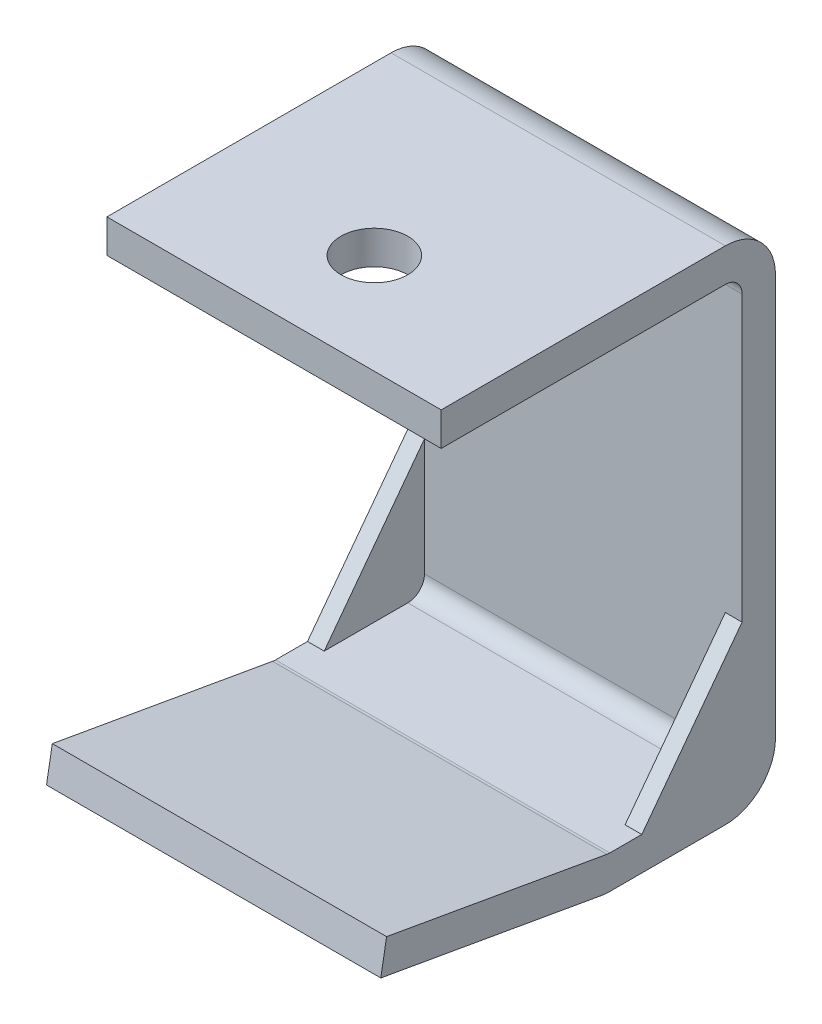
ISO-10303-21;
HEADER;
FILE_DESCRIPTION(('STEP AP214'),'2;1');
FILE_NAME('part.step','',(''),(''),'','','');
FILE_SCHEMA(('AUTOMOTIVE_DESIGN { 1 0 10303 214 1 1 1 1 }'));
ENDSEC;
DATA;
#1=APPLICATION_CONTEXT('core data for automotive mechanical design processes');
#2=APPLICATION_PROTOCOL_DEFINITION('international standard','automotive_design',2000,#1);
#3=PRODUCT_CONTEXT('',#1,'mechanical');
#4=PRODUCT('Part','Part','',(#3));
#5=PRODUCT_RELATED_PRODUCT_CATEGORY('part','',(#4));
#6=PRODUCT_DEFINITION_FORMATION('','',#4);
#7=PRODUCT_DEFINITION_CONTEXT('part definition',#1,'design');
#8=PRODUCT_DEFINITION('design','',#6,#7);
#9=PRODUCT_DEFINITION_SHAPE('','',#8);
#10=(LENGTH_UNIT() NAMED_UNIT(*) SI_UNIT(.MILLI.,.METRE.));
#11=(NAMED_UNIT(*) PLANE_ANGLE_UNIT() SI_UNIT($,.RADIAN.));
#12=(NAMED_UNIT(*) SI_UNIT($,.STERADIAN.) SOLID_ANGLE_UNIT());
#13=UNCERTAINTY_MEASURE_WITH_UNIT(LENGTH_MEASURE(1.E-05),#10,'distance_accuracy_value','');
#14=(GEOMETRIC_REPRESENTATION_CONTEXT(3) GLOBAL_UNCERTAINTY_ASSIGNED_CONTEXT((#13)) GLOBAL_UNIT_ASSIGNED_CONTEXT((#10,
#11,#12)) REPRESENTATION_CONTEXT('',''));
#15=CARTESIAN_POINT('',(0.,0.,0.));
#16=DIRECTION('',(0.,0.,1.));
#17=DIRECTION('',(1.,0.,0.));
#18=AXIS2_PLACEMENT_3D('',#15,#16,#17);
#19=CARTESIAN_POINT('',(31.75,3.175,3.175));
#20=DIRECTION('',(-1.,0.,0.));
#21=DIRECTION('',(0.,0.,1.));
#22=AXIS2_PLACEMENT_3D('',#19,#20,#21);
#23=CYLINDRICAL_SURFACE('',#22,3.175);
#24=DIRECTION('',(-1.,0.,0.));
#25=VECTOR('',#24,1.);
#26=CARTESIAN_POINT('',(31.75,3.175,0.));
#27=LINE('',#26,#25);
#28=CARTESIAN_POINT('',(28.575,3.175,0.));
#29=VERTEX_POINT('',#28);
#30=CARTESIAN_POINT('',(-28.575,3.175,0.));
#31=VERTEX_POINT('',#30);
#32=EDGE_CURVE('E391',#29,#31,#27,.T.);
#33=ORIENTED_EDGE('',*,*,#32,.T.);
#34=CARTESIAN_POINT('',(-28.575,3.175,3.175));
#35=DIRECTION('',(1.,0.,0.));
#36=DIRECTION('',(0.,0.,-1.));
#37=AXIS2_PLACEMENT_3D('',#34,#35,#36);
#38=CIRCLE('',#37,3.175);
#39=CARTESIAN_POINT('',(-28.575,0.,3.175));
#40=VERTEX_POINT('',#39);
#41=EDGE_CURVE('E210',#40,#31,#38,.T.);
#42=ORIENTED_EDGE('',*,*,#41,.F.);
#43=DIRECTION('',(-1.,0.,0.));
#44=VECTOR('',#43,1.);
#45=CARTESIAN_POINT('',(31.75,0.,3.175));
#46=LINE('',#45,#44);
#47=CARTESIAN_POINT('',(28.575,0.,3.175));
#48=VERTEX_POINT('',#47);
#49=EDGE_CURVE('E208',#48,#40,#46,.T.);
#50=ORIENTED_EDGE('',*,*,#49,.F.);
#51=CARTESIAN_POINT('',(28.575,3.175,3.175));
#52=DIRECTION('',(1.,0.,0.));
#53=DIRECTION('',(0.,0.,-1.));
#54=AXIS2_PLACEMENT_3D('',#51,#52,#53);
#55=CIRCLE('',#54,3.175);
#56=EDGE_CURVE('E226',#48,#29,#55,.T.);
#57=ORIENTED_EDGE('',*,*,#56,.T.);
#58=EDGE_LOOP('',(#33,#42,#50,#57));
#59=FACE_BOUND('',#58,.T.);
#60=ADVANCED_FACE('F47',(#59),#23,.F.);
#61=CARTESIAN_POINT('',(31.75,3.175,0.));
#62=DIRECTION('',(0.,0.,1.));
#63=DIRECTION('',(1.,0.,0.));
#64=AXIS2_PLACEMENT_3D('',#61,#62,#63);
#65=PLANE('',#64);
#66=DIRECTION('',(-1.,0.,0.));
#67=VECTOR('',#66,1.);
#68=CARTESIAN_POINT('',(-28.575,25.4,0.));
#69=LINE('',#68,#67);
#70=CARTESIAN_POINT('',(-28.575,25.4,0.));
#71=VERTEX_POINT('',#70);
#72=CARTESIAN_POINT('',(-31.75,25.4,0.));
#73=VERTEX_POINT('',#72);
#74=EDGE_CURVE('E195',#71,#73,#69,.T.);
#75=ORIENTED_EDGE('',*,*,#74,.F.);
#76=DIRECTION('',(0.,1.,0.));
#77=VECTOR('',#76,1.);
#78=CARTESIAN_POINT('',(-28.575,3.175,0.));
#79=LINE('',#78,#77);
#80=EDGE_CURVE('E202',#31,#71,#79,.T.);
#81=ORIENTED_EDGE('',*,*,#80,.F.);
#82=ORIENTED_EDGE('',*,*,#32,.F.);
#83=DIRECTION('',(0.,1.,0.));
#84=VECTOR('',#83,1.);
#85=CARTESIAN_POINT('',(28.575,3.175,0.));
#86=LINE('',#85,#84);
#87=CARTESIAN_POINT('',(28.575,25.4,0.));
#88=VERTEX_POINT('',#87);
#89=EDGE_CURVE('E71',#29,#88,#86,.T.);
#90=ORIENTED_EDGE('',*,*,#89,.T.);
#91=DIRECTION('',(1.,0.,0.));
#92=VECTOR('',#91,1.);
#93=CARTESIAN_POINT('',(28.575,25.4,0.));
#94=LINE('',#93,#92);
#95=CARTESIAN_POINT('',(31.75,25.4,0.));
#96=VERTEX_POINT('',#95);
#97=EDGE_CURVE('E239',#88,#96,#94,.T.);
#98=ORIENTED_EDGE('',*,*,#97,.T.);
#99=DIRECTION('',(0.,1.,0.));
#100=VECTOR('',#99,1.);
#101=CARTESIAN_POINT('',(31.75,3.175,0.));
#102=LINE('',#101,#100);
#103=CARTESIAN_POINT('',(31.75,79.375,0.));
#104=VERTEX_POINT('',#103);
#105=EDGE_CURVE('E267',#96,#104,#102,.T.);
#106=ORIENTED_EDGE('',*,*,#105,.T.);
#107=DIRECTION('',(-1.,0.,0.));
#108=VECTOR('',#107,1.);
#109=CARTESIAN_POINT('',(31.75,79.375,0.));
#110=LINE('',#109,#108);
#111=CARTESIAN_POINT('',(-31.75,79.375,0.));
#112=VERTEX_POINT('',#111);
#113=EDGE_CURVE('E395',#104,#112,#110,.T.);
#114=ORIENTED_EDGE('',*,*,#113,.T.);
#115=DIRECTION('',(0.,1.,0.));
#116=VECTOR('',#115,1.);
#117=CARTESIAN_POINT('',(-31.75,3.175,0.));
#118=LINE('',#117,#116);
#119=EDGE_CURVE('E319',#73,#112,#118,.T.);
#120=ORIENTED_EDGE('',*,*,#119,.F.);
#121=EDGE_LOOP('',(#75,#81,#82,#90,#98,#106,#114,#120));
#122=FACE_BOUND('',#121,.T.);
#123=ADVANCED_FACE('F487',(#122),#65,.T.);
#124=CARTESIAN_POINT('',(31.75,0.,25.1222234933052));
#125=DIRECTION('',(0.,1.,0.));
#126=DIRECTION('',(0.,0.,1.));
#127=AXIS2_PLACEMENT_3D('',#124,#125,#126);
#128=PLANE('',#127);
#129=DIRECTION('',(-1.,0.,0.));
#130=VECTOR('',#129,1.);
#131=CARTESIAN_POINT('',(-28.575,0.,19.05));
#132=LINE('',#131,#130);
#133=CARTESIAN_POINT('',(-28.575,0.,19.05));
#134=VERTEX_POINT('',#133);
#135=CARTESIAN_POINT('',(-31.75,0.,19.05));
#136=VERTEX_POINT('',#135);
#137=EDGE_CURVE('E185',#134,#136,#132,.T.);
#138=ORIENTED_EDGE('',*,*,#137,.T.);
#139=DIRECTION('',(0.,0.,-1.));
#140=VECTOR('',#139,1.);
#141=CARTESIAN_POINT('',(-31.75,0.,25.1222234933052));
#142=LINE('',#141,#140);
#143=CARTESIAN_POINT('',(-31.75,0.,25.1222234933052));
#144=VERTEX_POINT('',#143);
#145=EDGE_CURVE('E322',#144,#136,#142,.T.);
#146=ORIENTED_EDGE('',*,*,#145,.F.);
#147=DIRECTION('',(-1.,0.,0.));
#148=VECTOR('',#147,1.);
#149=CARTESIAN_POINT('',(31.75,0.,25.1222234933052));
#150=LINE('',#149,#148);
#151=CARTESIAN_POINT('',(31.75,0.,25.1222234933052));
#152=VERTEX_POINT('',#151);
#153=EDGE_CURVE('E386',#152,#144,#150,.T.);
#154=ORIENTED_EDGE('',*,*,#153,.F.);
#155=DIRECTION('',(0.,0.,-1.));
#156=VECTOR('',#155,1.);
#157=CARTESIAN_POINT('',(31.75,0.,25.1222234933052));
#158=LINE('',#157,#156);
#159=CARTESIAN_POINT('',(31.75,0.,19.05));
#160=VERTEX_POINT('',#159);
#161=EDGE_CURVE('E270',#152,#160,#158,.T.);
#162=ORIENTED_EDGE('',*,*,#161,.T.);
#163=DIRECTION('',(1.,0.,0.));
#164=VECTOR('',#163,1.);
#165=CARTESIAN_POINT('',(28.575,0.,19.05));
#166=LINE('',#165,#164);
#167=CARTESIAN_POINT('',(28.575,0.,19.05));
#168=VERTEX_POINT('',#167);
#169=EDGE_CURVE('E232',#168,#160,#166,.T.);
#170=ORIENTED_EDGE('',*,*,#169,.F.);
#171=DIRECTION('',(0.,0.,-1.));
#172=VECTOR('',#171,1.);
#173=CARTESIAN_POINT('',(28.575,0.,19.05));
#174=LINE('',#173,#172);
#175=EDGE_CURVE('E229',#168,#48,#174,.T.);
#176=ORIENTED_EDGE('',*,*,#175,.T.);
#177=ORIENTED_EDGE('',*,*,#49,.T.);
#178=DIRECTION('',(0.,0.,-1.));
#179=VECTOR('',#178,1.);
#180=CARTESIAN_POINT('',(-28.575,0.,19.05));
#181=LINE('',#180,#179);
#182=EDGE_CURVE('E199',#134,#40,#181,.T.);
#183=ORIENTED_EDGE('',*,*,#182,.F.);
#184=EDGE_LOOP('',(#138,#146,#154,#162,#170,#176,#177,#183));
#185=FACE_BOUND('',#184,.T.);
#186=ADVANCED_FACE('F206',(#185),#128,.T.);
#187=CARTESIAN_POINT('',(31.75,88.9,3.175));
#188=DIRECTION('',(0.,-1.,0.));
#189=DIRECTION('',(0.,0.,-1.));
#190=AXIS2_PLACEMENT_3D('',#187,#188,#189);
#191=PLANE('',#190);
#192=CARTESIAN_POINT('',(0.,88.9,38.1));
#193=DIRECTION('',(0.,1.,0.));
#194=DIRECTION('',(0.,0.,1.));
#195=AXIS2_PLACEMENT_3D('',#192,#193,#194);
#196=CIRCLE('',#195,6.35);
#197=CARTESIAN_POINT('',(0.,88.9,44.45));
#198=VERTEX_POINT('',#197);
#199=EDGE_CURVE('E246',#198,#198,#196,.T.);
#200=ORIENTED_EDGE('',*,*,#199,.F.);
#201=EDGE_LOOP('',(#200));
#202=FACE_BOUND('',#201,.T.);
#203=DIRECTION('',(0.,0.,1.));
#204=VECTOR('',#203,1.);
#205=CARTESIAN_POINT('',(-31.75,88.9,3.175));
#206=LINE('',#205,#204);
#207=CARTESIAN_POINT('',(-31.75,88.9,3.175));
#208=VERTEX_POINT('',#207);
#209=CARTESIAN_POINT('',(-31.75,88.9,57.15));
#210=VERTEX_POINT('',#209);
#211=EDGE_CURVE('E250',#208,#210,#206,.T.);
#212=ORIENTED_EDGE('',*,*,#211,.T.);
#213=DIRECTION('',(-1.,0.,0.));
#214=VECTOR('',#213,1.);
#215=CARTESIAN_POINT('',(31.75,88.9,57.15));
#216=LINE('',#215,#214);
#217=CARTESIAN_POINT('',(31.75,88.9,57.15));
#218=VERTEX_POINT('',#217);
#219=EDGE_CURVE('E11',#218,#210,#216,.T.);
#220=ORIENTED_EDGE('',*,*,#219,.F.);
#221=DIRECTION('',(0.,0.,1.));
#222=VECTOR('',#221,1.);
#223=CARTESIAN_POINT('',(31.75,88.9,3.175));
#224=LINE('',#223,#222);
#225=CARTESIAN_POINT('',(31.75,88.9,3.175));
#226=VERTEX_POINT('',#225);
#227=EDGE_CURVE('E251',#226,#218,#224,.T.);
#228=ORIENTED_EDGE('',*,*,#227,.F.);
#229=DIRECTION('',(-1.,0.,0.));
#230=VECTOR('',#229,1.);
#231=CARTESIAN_POINT('',(31.75,88.9,3.175));
#232=LINE('',#231,#230);
#233=EDGE_CURVE('E303',#226,#208,#232,.T.);
#234=ORIENTED_EDGE('',*,*,#233,.T.);
#235=EDGE_LOOP('',(#212,#220,#228,#234));
#236=FACE_BOUND('',#235,.T.);
#237=ADVANCED_FACE('F49',(#202,#236),#191,.F.);
#238=CARTESIAN_POINT('',(31.75,82.55,57.15));
#239=DIRECTION('',(0.,0.,1.));
#240=DIRECTION('',(1.,0.,0.));
#241=AXIS2_PLACEMENT_3D('',#238,#239,#240);
#242=PLANE('',#241);
#243=DIRECTION('',(0.,1.,0.));
#244=VECTOR('',#243,1.);
#245=CARTESIAN_POINT('',(-31.75,82.55,57.15));
#246=LINE('',#245,#244);
#247=CARTESIAN_POINT('',(-31.75,82.55,57.15));
#248=VERTEX_POINT('',#247);
#249=EDGE_CURVE('E307',#248,#210,#246,.T.);
#250=ORIENTED_EDGE('',*,*,#249,.F.);
#251=DIRECTION('',(-1.,0.,0.));
#252=VECTOR('',#251,1.);
#253=CARTESIAN_POINT('',(31.75,82.55,57.15));
#254=LINE('',#253,#252);
#255=CARTESIAN_POINT('',(31.75,82.55,57.15));
#256=VERTEX_POINT('',#255);
#257=EDGE_CURVE('E56',#256,#248,#254,.T.);
#258=ORIENTED_EDGE('',*,*,#257,.F.);
#259=DIRECTION('',(0.,1.,0.));
#260=VECTOR('',#259,1.);
#261=CARTESIAN_POINT('',(31.75,82.55,57.15));
#262=LINE('',#261,#260);
#263=EDGE_CURVE('E254',#256,#218,#262,.T.);
#264=ORIENTED_EDGE('',*,*,#263,.T.);
#265=ORIENTED_EDGE('',*,*,#219,.T.);
#266=EDGE_LOOP('',(#250,#258,#264,#265));
#267=FACE_BOUND('',#266,.T.);
#268=ADVANCED_FACE('F409',(#267),#242,.T.);
#269=CARTESIAN_POINT('',(31.75,82.55,3.175));
#270=DIRECTION('',(0.,-1.,0.));
#271=DIRECTION('',(0.,0.,-1.));
#272=AXIS2_PLACEMENT_3D('',#269,#270,#271);
#273=PLANE('',#272);
#274=CARTESIAN_POINT('',(0.,82.55,38.1));
#275=DIRECTION('',(0.,-1.,0.));
#276=DIRECTION('',(0.,0.,-1.));
#277=AXIS2_PLACEMENT_3D('',#274,#275,#276);
#278=CIRCLE('',#277,6.35);
#279=CARTESIAN_POINT('',(0.,82.55,31.75));
#280=VERTEX_POINT('',#279);
#281=EDGE_CURVE('E242',#280,#280,#278,.F.);
#282=ORIENTED_EDGE('',*,*,#281,.T.);
#283=EDGE_LOOP('',(#282));
#284=FACE_BOUND('',#283,.T.);
#285=DIRECTION('',(0.,0.,1.));
#286=VECTOR('',#285,1.);
#287=CARTESIAN_POINT('',(-31.75,82.55,3.175));
#288=LINE('',#287,#286);
#289=CARTESIAN_POINT('',(-31.75,82.55,3.175));
#290=VERTEX_POINT('',#289);
#291=EDGE_CURVE('E311',#290,#248,#288,.T.);
#292=ORIENTED_EDGE('',*,*,#291,.F.);
#293=DIRECTION('',(-1.,0.,0.));
#294=VECTOR('',#293,1.);
#295=CARTESIAN_POINT('',(31.75,82.55,3.175));
#296=LINE('',#295,#294);
#297=CARTESIAN_POINT('',(31.75,82.55,3.175));
#298=VERTEX_POINT('',#297);
#299=EDGE_CURVE('E399',#298,#290,#296,.T.);
#300=ORIENTED_EDGE('',*,*,#299,.F.);
#301=DIRECTION('',(0.,0.,1.));
#302=VECTOR('',#301,1.);
#303=CARTESIAN_POINT('',(31.75,82.55,3.175));
#304=LINE('',#303,#302);
#305=EDGE_CURVE('E259',#298,#256,#304,.T.);
#306=ORIENTED_EDGE('',*,*,#305,.T.);
#307=ORIENTED_EDGE('',*,*,#257,.T.);
#308=EDGE_LOOP('',(#292,#300,#306,#307));
#309=FACE_BOUND('',#308,.T.);
#310=ADVANCED_FACE('F405',(#284,#309),#273,.T.);
#311=CARTESIAN_POINT('',(31.75,79.375,3.175));
#312=DIRECTION('',(-1.,0.,0.));
#313=DIRECTION('',(0.,0.,1.));
#314=AXIS2_PLACEMENT_3D('',#311,#312,#313);
#315=CYLINDRICAL_SURFACE('',#314,3.175);
#316=CARTESIAN_POINT('',(-31.75,79.375,3.175));
#317=DIRECTION('',(1.,0.,0.));
#318=DIRECTION('',(0.,0.,-1.));
#319=AXIS2_PLACEMENT_3D('',#316,#317,#318);
#320=CIRCLE('',#319,3.175);
#321=EDGE_CURVE('E315',#112,#290,#320,.T.);
#322=ORIENTED_EDGE('',*,*,#321,.F.);
#323=ORIENTED_EDGE('',*,*,#113,.F.);
#324=CARTESIAN_POINT('',(31.75,79.375,3.175));
#325=DIRECTION('',(1.,0.,0.));
#326=DIRECTION('',(0.,0.,-1.));
#327=AXIS2_PLACEMENT_3D('',#324,#325,#326);
#328=CIRCLE('',#327,3.175);
#329=EDGE_CURVE('E263',#104,#298,#328,.T.);
#330=ORIENTED_EDGE('',*,*,#329,.T.);
#331=ORIENTED_EDGE('',*,*,#299,.T.);
#332=EDGE_LOOP('',(#322,#323,#330,#331));
#333=FACE_BOUND('',#332,.T.);
#334=ADVANCED_FACE('F417',(#333),#315,.F.);
#335=CARTESIAN_POINT('',(31.75,3.175,25.1222234933052));
#336=DIRECTION('',(-1.,0.,0.));
#337=DIRECTION('',(0.,0.,1.));
#338=AXIS2_PLACEMENT_3D('',#335,#336,#337);
#339=CYLINDRICAL_SURFACE('',#338,3.175);
#340=CARTESIAN_POINT('',(-31.75,3.175,25.1222234933052));
#341=DIRECTION('',(1.,0.,0.));
#342=DIRECTION('',(0.,0.,-1.));
#343=AXIS2_PLACEMENT_3D('',#340,#341,#342);
#344=CIRCLE('',#343,3.175);
#345=CARTESIAN_POINT('',(-31.75,0.0482353841862412,25.6735564573977));
#346=VERTEX_POINT('',#345);
#347=EDGE_CURVE('E325',#346,#144,#344,.T.);
#348=ORIENTED_EDGE('',*,*,#347,.F.);
#349=DIRECTION('',(-1.,0.,0.));
#350=VECTOR('',#349,1.);
#351=CARTESIAN_POINT('',(31.75,0.0482353841862412,25.6735564573977));
#352=LINE('',#351,#350);
#353=CARTESIAN_POINT('',(31.75,0.0482353841862412,25.6735564573977));
#354=VERTEX_POINT('',#353);
#355=EDGE_CURVE('E383',#354,#346,#352,.T.);
#356=ORIENTED_EDGE('',*,*,#355,.F.);
#357=CARTESIAN_POINT('',(31.75,3.175,25.1222234933052));
#358=DIRECTION('',(1.,0.,0.));
#359=DIRECTION('',(0.,0.,-1.));
#360=AXIS2_PLACEMENT_3D('',#357,#358,#359);
#361=CIRCLE('',#360,3.175);
#362=EDGE_CURVE('E273',#354,#152,#361,.T.);
#363=ORIENTED_EDGE('',*,*,#362,.T.);
#364=ORIENTED_EDGE('',*,*,#153,.T.);
#365=EDGE_LOOP('',(#348,#356,#363,#364));
#366=FACE_BOUND('',#365,.T.);
#367=ADVANCED_FACE('F464',(#366),#339,.F.);
#368=CARTESIAN_POINT('',(31.75,7.42755769225422,67.523772904243));
#369=DIRECTION('',(0.,0.984807753012208,-0.173648177666931));
#370=DIRECTION('',(0.,0.173648177666931,0.984807753012208));
#371=AXIS2_PLACEMENT_3D('',#368,#369,#370);
#372=PLANE('',#371);
#373=DIRECTION('',(0.,-0.173648177666931,-0.984807753012208));
#374=VECTOR('',#373,1.);
#375=CARTESIAN_POINT('',(-31.75,7.42755769225422,67.523772904243));
#376=LINE('',#375,#374);
#377=CARTESIAN_POINT('',(-31.75,7.42755769225422,67.523772904243));
#378=VERTEX_POINT('',#377);
#379=EDGE_CURVE('E329',#378,#346,#376,.T.);
#380=ORIENTED_EDGE('',*,*,#379,.F.);
#381=DIRECTION('',(-1.,0.,0.));
#382=VECTOR('',#381,1.);
#383=CARTESIAN_POINT('',(31.75,7.42755769225422,67.523772904243));
#384=LINE('',#383,#382);
#385=CARTESIAN_POINT('',(31.75,7.42755769225422,67.523772904243));
#386=VERTEX_POINT('',#385);
#387=EDGE_CURVE('E380',#386,#378,#384,.T.);
#388=ORIENTED_EDGE('',*,*,#387,.F.);
#389=DIRECTION('',(0.,-0.173648177666931,-0.984807753012208));
#390=VECTOR('',#389,1.);
#391=CARTESIAN_POINT('',(31.75,7.42755769225422,67.523772904243));
#392=LINE('',#391,#390);
#393=EDGE_CURVE('E277',#386,#354,#392,.T.);
#394=ORIENTED_EDGE('',*,*,#393,.T.);
#395=ORIENTED_EDGE('',*,*,#355,.T.);
#396=EDGE_LOOP('',(#380,#388,#394,#395));
#397=FACE_BOUND('',#396,.T.);
#398=ADVANCED_FACE('F461',(#397),#372,.T.);
#399=CARTESIAN_POINT('',(31.75,1.1740284606267,68.626438832428));
#400=DIRECTION('',(0.,0.17364817766693,0.984807753012208));
#401=DIRECTION('',(0.,-0.984807753012208,0.17364817766693));
#402=AXIS2_PLACEMENT_3D('',#399,#400,#401);
#403=PLANE('',#402);
#404=DIRECTION('',(0.,0.984807753012208,-0.17364817766693));
#405=VECTOR('',#404,1.);
#406=CARTESIAN_POINT('',(-31.75,1.1740284606267,68.626438832428));
#407=LINE('',#406,#405);
#408=CARTESIAN_POINT('',(-31.75,1.1740284606267,68.626438832428));
#409=VERTEX_POINT('',#408);
#410=EDGE_CURVE('E333',#409,#378,#407,.T.);
#411=ORIENTED_EDGE('',*,*,#410,.F.);
#412=DIRECTION('',(-1.,0.,0.));
#413=VECTOR('',#412,1.);
#414=CARTESIAN_POINT('',(31.75,1.1740284606267,68.626438832428));
#415=LINE('',#414,#413);
#416=CARTESIAN_POINT('',(31.75,1.1740284606267,68.626438832428));
#417=VERTEX_POINT('',#416);
#418=EDGE_CURVE('E377',#417,#409,#415,.T.);
#419=ORIENTED_EDGE('',*,*,#418,.F.);
#420=DIRECTION('',(0.,0.984807753012208,-0.17364817766693));
#421=VECTOR('',#420,1.);
#422=CARTESIAN_POINT('',(31.75,1.1740284606267,68.626438832428));
#423=LINE('',#422,#421);
#424=EDGE_CURVE('E281',#417,#386,#423,.T.);
#425=ORIENTED_EDGE('',*,*,#424,.T.);
#426=ORIENTED_EDGE('',*,*,#387,.T.);
#427=EDGE_LOOP('',(#411,#419,#425,#426));
#428=FACE_BOUND('',#427,.T.);
#429=ADVANCED_FACE('F457',(#428),#403,.T.);
#430=CARTESIAN_POINT('',(31.75,1.1740284606267,68.626438832428));
#431=DIRECTION('',(0.,0.984807753012208,-0.173648177666931));
#432=DIRECTION('',(0.,0.173648177666931,0.984807753012208));
#433=AXIS2_PLACEMENT_3D('',#430,#431,#432);
#434=PLANE('',#433);
#435=DIRECTION('',(0.,-0.173648177666931,-0.984807753012208));
#436=VECTOR('',#435,1.);
#437=CARTESIAN_POINT('',(-31.75,1.1740284606267,68.626438832428));
#438=LINE('',#437,#436);
#439=CARTESIAN_POINT('',(-31.75,-6.20529384744128,26.7762223855827));
#440=VERTEX_POINT('',#439);
#441=EDGE_CURVE('E337',#409,#440,#438,.T.);
#442=ORIENTED_EDGE('',*,*,#441,.T.);
#443=DIRECTION('',(-1.,0.,0.));
#444=VECTOR('',#443,1.);
#445=CARTESIAN_POINT('',(31.75,-6.20529384744128,26.7762223855827));
#446=LINE('',#445,#444);
#447=CARTESIAN_POINT('',(31.75,-6.20529384744128,26.7762223855827));
#448=VERTEX_POINT('',#447);
#449=EDGE_CURVE('E373',#448,#440,#446,.T.);
#450=ORIENTED_EDGE('',*,*,#449,.F.);
#451=DIRECTION('',(0.,-0.173648177666931,-0.984807753012208));
#452=VECTOR('',#451,1.);
#453=CARTESIAN_POINT('',(31.75,1.1740284606267,68.626438832428));
#454=LINE('',#453,#452);
#455=EDGE_CURVE('E285',#417,#448,#454,.T.);
#456=ORIENTED_EDGE('',*,*,#455,.F.);
#457=ORIENTED_EDGE('',*,*,#418,.T.);
#458=EDGE_LOOP('',(#442,#450,#456,#457));
#459=FACE_BOUND('',#458,.T.);
#460=ADVANCED_FACE('F453',(#459),#434,.F.);
#461=CARTESIAN_POINT('',(31.75,3.175,25.1222234933052));
#462=DIRECTION('',(-1.,0.,0.));
#463=DIRECTION('',(0.,0.,1.));
#464=AXIS2_PLACEMENT_3D('',#461,#462,#463);
#465=CYLINDRICAL_SURFACE('',#464,9.525);
#466=CARTESIAN_POINT('',(-31.75,3.175,25.1222234933052));
#467=DIRECTION('',(1.,0.,0.));
#468=DIRECTION('',(0.,0.,-1.));
#469=AXIS2_PLACEMENT_3D('',#466,#467,#468);
#470=CIRCLE('',#469,9.525);
#471=CARTESIAN_POINT('',(-31.75,-6.35,25.1222234933052));
#472=VERTEX_POINT('',#471);
#473=EDGE_CURVE('E340',#440,#472,#470,.T.);
#474=ORIENTED_EDGE('',*,*,#473,.T.);
#475=DIRECTION('',(-1.,0.,0.));
#476=VECTOR('',#475,1.);
#477=CARTESIAN_POINT('',(31.75,-6.35,25.1222234933052));
#478=LINE('',#477,#476);
#479=CARTESIAN_POINT('',(31.75,-6.35,25.1222234933052));
#480=VERTEX_POINT('',#479);
#481=EDGE_CURVE('E369',#480,#472,#478,.T.);
#482=ORIENTED_EDGE('',*,*,#481,.F.);
#483=CARTESIAN_POINT('',(31.75,3.175,25.1222234933052));
#484=DIRECTION('',(1.,0.,0.));
#485=DIRECTION('',(0.,0.,-1.));
#486=AXIS2_PLACEMENT_3D('',#483,#484,#485);
#487=CIRCLE('',#486,9.525);
#488=EDGE_CURVE('E288',#448,#480,#487,.T.);
#489=ORIENTED_EDGE('',*,*,#488,.F.);
#490=ORIENTED_EDGE('',*,*,#449,.T.);
#491=EDGE_LOOP('',(#474,#482,#489,#490));
#492=FACE_BOUND('',#491,.T.);
#493=ADVANCED_FACE('F449',(#492),#465,.T.);
#494=CARTESIAN_POINT('',(31.75,-6.35,25.1222234933052));
#495=DIRECTION('',(0.,1.,0.));
#496=DIRECTION('',(0.,0.,1.));
#497=AXIS2_PLACEMENT_3D('',#494,#495,#496);
#498=PLANE('',#497);
#499=DIRECTION('',(0.,0.,-1.));
#500=VECTOR('',#499,1.);
#501=CARTESIAN_POINT('',(-31.75,-6.35,25.1222234933052));
#502=LINE('',#501,#500);
#503=CARTESIAN_POINT('',(-31.75,-6.35,3.175));
#504=VERTEX_POINT('',#503);
#505=EDGE_CURVE('E343',#472,#504,#502,.T.);
#506=ORIENTED_EDGE('',*,*,#505,.T.);
#507=DIRECTION('',(-1.,0.,0.));
#508=VECTOR('',#507,1.);
#509=CARTESIAN_POINT('',(31.75,-6.35,3.175));
#510=LINE('',#509,#508);
#511=CARTESIAN_POINT('',(31.75,-6.35,3.175));
#512=VERTEX_POINT('',#511);
#513=EDGE_CURVE('E365',#512,#504,#510,.T.);
#514=ORIENTED_EDGE('',*,*,#513,.F.);
#515=DIRECTION('',(0.,0.,-1.));
#516=VECTOR('',#515,1.);
#517=CARTESIAN_POINT('',(31.75,-6.35,25.1222234933052));
#518=LINE('',#517,#516);
#519=EDGE_CURVE('E291',#480,#512,#518,.T.);
#520=ORIENTED_EDGE('',*,*,#519,.F.);
#521=ORIENTED_EDGE('',*,*,#481,.T.);
#522=EDGE_LOOP('',(#506,#514,#520,#521));
#523=FACE_BOUND('',#522,.T.);
#524=ADVANCED_FACE('F444',(#523),#498,.F.);
#525=CARTESIAN_POINT('',(31.75,3.175,3.175));
#526=DIRECTION('',(-1.,0.,0.));
#527=DIRECTION('',(0.,0.,1.));
#528=AXIS2_PLACEMENT_3D('',#525,#526,#527);
#529=CYLINDRICAL_SURFACE('',#528,9.525);
#530=CARTESIAN_POINT('',(-31.75,3.175,3.175));
#531=DIRECTION('',(1.,0.,0.));
#532=DIRECTION('',(0.,0.,-1.));
#533=AXIS2_PLACEMENT_3D('',#530,#531,#532);
#534=CIRCLE('',#533,9.525);
#535=CARTESIAN_POINT('',(-31.75,3.175,-6.35));
#536=VERTEX_POINT('',#535);
#537=EDGE_CURVE('E346',#504,#536,#534,.T.);
#538=ORIENTED_EDGE('',*,*,#537,.T.);
#539=DIRECTION('',(-1.,0.,0.));
#540=VECTOR('',#539,1.);
#541=CARTESIAN_POINT('',(31.75,3.175,-6.35));
#542=LINE('',#541,#540);
#543=CARTESIAN_POINT('',(31.75,3.175,-6.35));
#544=VERTEX_POINT('',#543);
#545=EDGE_CURVE('E361',#544,#536,#542,.T.);
#546=ORIENTED_EDGE('',*,*,#545,.F.);
#547=CARTESIAN_POINT('',(31.75,3.175,3.175));
#548=DIRECTION('',(1.,0.,0.));
#549=DIRECTION('',(0.,0.,-1.));
#550=AXIS2_PLACEMENT_3D('',#547,#548,#549);
#551=CIRCLE('',#550,9.525);
#552=EDGE_CURVE('E294',#512,#544,#551,.T.);
#553=ORIENTED_EDGE('',*,*,#552,.F.);
#554=ORIENTED_EDGE('',*,*,#513,.T.);
#555=EDGE_LOOP('',(#538,#546,#553,#554));
#556=FACE_BOUND('',#555,.T.);
#557=ADVANCED_FACE('F438',(#556),#529,.T.);
#558=CARTESIAN_POINT('',(31.75,3.175,-6.35));
#559=DIRECTION('',(0.,0.,1.));
#560=DIRECTION('',(1.,0.,0.));
#561=AXIS2_PLACEMENT_3D('',#558,#559,#560);
#562=PLANE('',#561);
#563=DIRECTION('',(0.,1.,0.));
#564=VECTOR('',#563,1.);
#565=CARTESIAN_POINT('',(-31.75,3.175,-6.35));
#566=LINE('',#565,#564);
#567=CARTESIAN_POINT('',(-31.75,79.375,-6.35));
#568=VERTEX_POINT('',#567);
#569=EDGE_CURVE('E349',#536,#568,#566,.T.);
#570=ORIENTED_EDGE('',*,*,#569,.T.);
#571=DIRECTION('',(-1.,0.,0.));
#572=VECTOR('',#571,1.);
#573=CARTESIAN_POINT('',(31.75,79.375,-6.35));
#574=LINE('',#573,#572);
#575=CARTESIAN_POINT('',(31.75,79.375,-6.35));
#576=VERTEX_POINT('',#575);
#577=EDGE_CURVE('E357',#576,#568,#574,.T.);
#578=ORIENTED_EDGE('',*,*,#577,.F.);
#579=DIRECTION('',(0.,1.,0.));
#580=VECTOR('',#579,1.);
#581=CARTESIAN_POINT('',(31.75,3.175,-6.35));
#582=LINE('',#581,#580);
#583=EDGE_CURVE('E297',#544,#576,#582,.T.);
#584=ORIENTED_EDGE('',*,*,#583,.F.);
#585=ORIENTED_EDGE('',*,*,#545,.T.);
#586=EDGE_LOOP('',(#570,#578,#584,#585));
#587=FACE_BOUND('',#586,.T.);
#588=ADVANCED_FACE('F434',(#587),#562,.F.);
#589=CARTESIAN_POINT('',(31.75,79.375,3.175));
#590=DIRECTION('',(-1.,0.,0.));
#591=DIRECTION('',(0.,0.,1.));
#592=AXIS2_PLACEMENT_3D('',#589,#590,#591);
#593=CYLINDRICAL_SURFACE('',#592,9.525);
#594=CARTESIAN_POINT('',(-31.75,79.375,3.175));
#595=DIRECTION('',(1.,0.,0.));
#596=DIRECTION('',(0.,0.,-1.));
#597=AXIS2_PLACEMENT_3D('',#594,#595,#596);
#598=CIRCLE('',#597,9.525);
#599=EDGE_CURVE('E255',#568,#208,#598,.T.);
#600=ORIENTED_EDGE('',*,*,#599,.T.);
#601=ORIENTED_EDGE('',*,*,#233,.F.);
#602=CARTESIAN_POINT('',(31.75,79.375,3.175));
#603=DIRECTION('',(1.,0.,0.));
#604=DIRECTION('',(0.,0.,-1.));
#605=AXIS2_PLACEMENT_3D('',#602,#603,#604);
#606=CIRCLE('',#605,9.525);
#607=EDGE_CURVE('E300',#576,#226,#606,.T.);
#608=ORIENTED_EDGE('',*,*,#607,.F.);
#609=ORIENTED_EDGE('',*,*,#577,.T.);
#610=EDGE_LOOP('',(#600,#601,#608,#609));
#611=FACE_BOUND('',#610,.T.);
#612=ADVANCED_FACE('F430',(#611),#593,.T.);
#613=CARTESIAN_POINT('',(31.75,79.375,3.175));
#614=DIRECTION('',(1.,0.,0.));
#615=DIRECTION('',(0.,0.,-1.));
#616=AXIS2_PLACEMENT_3D('',#613,#614,#615);
#617=PLANE('',#616);
#618=ORIENTED_EDGE('',*,*,#105,.F.);
#619=DIRECTION('',(0.,0.8,-0.6));
#620=VECTOR('',#619,1.);
#621=CARTESIAN_POINT('',(31.75,0.,19.05));
#622=LINE('',#621,#620);
#623=EDGE_CURVE('E194',#160,#96,#622,.T.);
#624=ORIENTED_EDGE('',*,*,#623,.F.);
#625=ORIENTED_EDGE('',*,*,#161,.F.);
#626=ORIENTED_EDGE('',*,*,#362,.F.);
#627=ORIENTED_EDGE('',*,*,#393,.F.);
#628=ORIENTED_EDGE('',*,*,#424,.F.);
#629=ORIENTED_EDGE('',*,*,#455,.T.);
#630=ORIENTED_EDGE('',*,*,#488,.T.);
#631=ORIENTED_EDGE('',*,*,#519,.T.);
#632=ORIENTED_EDGE('',*,*,#552,.T.);
#633=ORIENTED_EDGE('',*,*,#583,.T.);
#634=ORIENTED_EDGE('',*,*,#607,.T.);
#635=ORIENTED_EDGE('',*,*,#227,.T.);
#636=ORIENTED_EDGE('',*,*,#263,.F.);
#637=ORIENTED_EDGE('',*,*,#305,.F.);
#638=ORIENTED_EDGE('',*,*,#329,.F.);
#639=EDGE_LOOP('',(#618,#624,#625,#626,#627,#628,#629,#630,#631,#632,#633,#634,#635,#636,#637,#638));
#640=FACE_BOUND('',#639,.T.);
#641=ADVANCED_FACE('F421',(#640),#617,.T.);
#642=CARTESIAN_POINT('',(-31.75,79.375,3.175));
#643=DIRECTION('',(1.,0.,0.));
#644=DIRECTION('',(0.,0.,-1.));
#645=AXIS2_PLACEMENT_3D('',#642,#643,#644);
#646=PLANE('',#645);
#647=ORIENTED_EDGE('',*,*,#211,.F.);
#648=ORIENTED_EDGE('',*,*,#599,.F.);
#649=ORIENTED_EDGE('',*,*,#569,.F.);
#650=ORIENTED_EDGE('',*,*,#537,.F.);
#651=ORIENTED_EDGE('',*,*,#505,.F.);
#652=ORIENTED_EDGE('',*,*,#473,.F.);
#653=ORIENTED_EDGE('',*,*,#441,.F.);
#654=ORIENTED_EDGE('',*,*,#410,.T.);
#655=ORIENTED_EDGE('',*,*,#379,.T.);
#656=ORIENTED_EDGE('',*,*,#347,.T.);
#657=ORIENTED_EDGE('',*,*,#145,.T.);
#658=DIRECTION('',(0.,0.8,-0.6));
#659=VECTOR('',#658,1.);
#660=CARTESIAN_POINT('',(-31.75,0.,19.05));
#661=LINE('',#660,#659);
#662=EDGE_CURVE('E63',#136,#73,#661,.T.);
#663=ORIENTED_EDGE('',*,*,#662,.T.);
#664=ORIENTED_EDGE('',*,*,#119,.T.);
#665=ORIENTED_EDGE('',*,*,#321,.T.);
#666=ORIENTED_EDGE('',*,*,#291,.T.);
#667=ORIENTED_EDGE('',*,*,#249,.T.);
#668=EDGE_LOOP('',(#647,#648,#649,#650,#651,#652,#653,#654,#655,#656,#657,#663,#664,#665,#666,#667));
#669=FACE_BOUND('',#668,.T.);
#670=ADVANCED_FACE('F412',(#669),#646,.F.);
#671=CARTESIAN_POINT('',(0.,-6.351,38.1));
#672=DIRECTION('',(0.,1.,0.));
#673=DIRECTION('',(0.,0.,1.));
#674=AXIS2_PLACEMENT_3D('',#671,#672,#673);
#675=CYLINDRICAL_SURFACE('',#674,6.35);
#676=ORIENTED_EDGE('',*,*,#281,.F.);
#677=EDGE_LOOP('',(#676));
#678=FACE_BOUND('',#677,.T.);
#679=ORIENTED_EDGE('',*,*,#199,.T.);
#680=EDGE_LOOP('',(#679));
#681=FACE_BOUND('',#680,.T.);
#682=ADVANCED_FACE('F485',(#678,#681),#675,.F.);
#683=CARTESIAN_POINT('',(28.575,0.,19.05));
#684=DIRECTION('',(0.,-0.6,-0.8));
#685=DIRECTION('',(0.,0.8,-0.6));
#686=AXIS2_PLACEMENT_3D('',#683,#684,#685);
#687=PLANE('',#686);
#688=ORIENTED_EDGE('',*,*,#623,.T.);
#689=ORIENTED_EDGE('',*,*,#97,.F.);
#690=DIRECTION('',(0.,0.8,-0.6));
#691=VECTOR('',#690,1.);
#692=CARTESIAN_POINT('',(28.575,0.,19.05));
#693=LINE('',#692,#691);
#694=EDGE_CURVE('E221',#168,#88,#693,.T.);
#695=ORIENTED_EDGE('',*,*,#694,.F.);
#696=ORIENTED_EDGE('',*,*,#169,.T.);
#697=EDGE_LOOP('',(#688,#689,#695,#696));
#698=FACE_BOUND('',#697,.T.);
#699=ADVANCED_FACE('F470',(#698),#687,.F.);
#700=CARTESIAN_POINT('',(28.575,3.175,3.175));
#701=DIRECTION('',(1.,0.,0.));
#702=DIRECTION('',(0.,0.,-1.));
#703=AXIS2_PLACEMENT_3D('',#700,#701,#702);
#704=PLANE('',#703);
#705=ORIENTED_EDGE('',*,*,#694,.T.);
#706=ORIENTED_EDGE('',*,*,#89,.F.);
#707=ORIENTED_EDGE('',*,*,#56,.F.);
#708=ORIENTED_EDGE('',*,*,#175,.F.);
#709=EDGE_LOOP('',(#705,#706,#707,#708));
#710=FACE_BOUND('',#709,.T.);
#711=ADVANCED_FACE('F476',(#710),#704,.F.);
#712=CARTESIAN_POINT('',(-28.575,0.,19.05));
#713=DIRECTION('',(0.,0.6,0.8));
#714=DIRECTION('',(0.,-0.8,0.6));
#715=AXIS2_PLACEMENT_3D('',#712,#713,#714);
#716=PLANE('',#715);
#717=ORIENTED_EDGE('',*,*,#662,.F.);
#718=ORIENTED_EDGE('',*,*,#137,.F.);
#719=DIRECTION('',(0.,0.8,-0.6));
#720=VECTOR('',#719,1.);
#721=CARTESIAN_POINT('',(-28.575,0.,19.05));
#722=LINE('',#721,#720);
#723=EDGE_CURVE('E188',#134,#71,#722,.T.);
#724=ORIENTED_EDGE('',*,*,#723,.T.);
#725=ORIENTED_EDGE('',*,*,#74,.T.);
#726=EDGE_LOOP('',(#717,#718,#724,#725));
#727=FACE_BOUND('',#726,.T.);
#728=ADVANCED_FACE('F187',(#727),#716,.T.);
#729=CARTESIAN_POINT('',(-28.575,3.175,3.175));
#730=DIRECTION('',(-1.,0.,0.));
#731=DIRECTION('',(0.,0.,-1.));
#732=AXIS2_PLACEMENT_3D('',#729,#730,#731);
#733=PLANE('',#732);
#734=ORIENTED_EDGE('',*,*,#723,.F.);
#735=ORIENTED_EDGE('',*,*,#182,.T.);
#736=ORIENTED_EDGE('',*,*,#41,.T.);
#737=ORIENTED_EDGE('',*,*,#80,.T.);
#738=EDGE_LOOP('',(#734,#735,#736,#737));
#739=FACE_BOUND('',#738,.T.);
#740=ADVANCED_FACE('F198',(#739),#733,.F.);
#741=CLOSED_SHELL('',(#60,#123,#186,#237,#268,#310,#334,#367,#398,#429,#460,#493,#524,#557,#588,
#612,#641,#670,#682,#699,#711,#728,#740));
#742=MANIFOLD_SOLID_BREP('B2',#741);
#743=ADVANCED_BREP_SHAPE_REPRESENTATION('',(#18,#742),#14);
#744=SHAPE_DEFINITION_REPRESENTATION(#9,#743);
ENDSEC;
END-ISO-10303-21;
